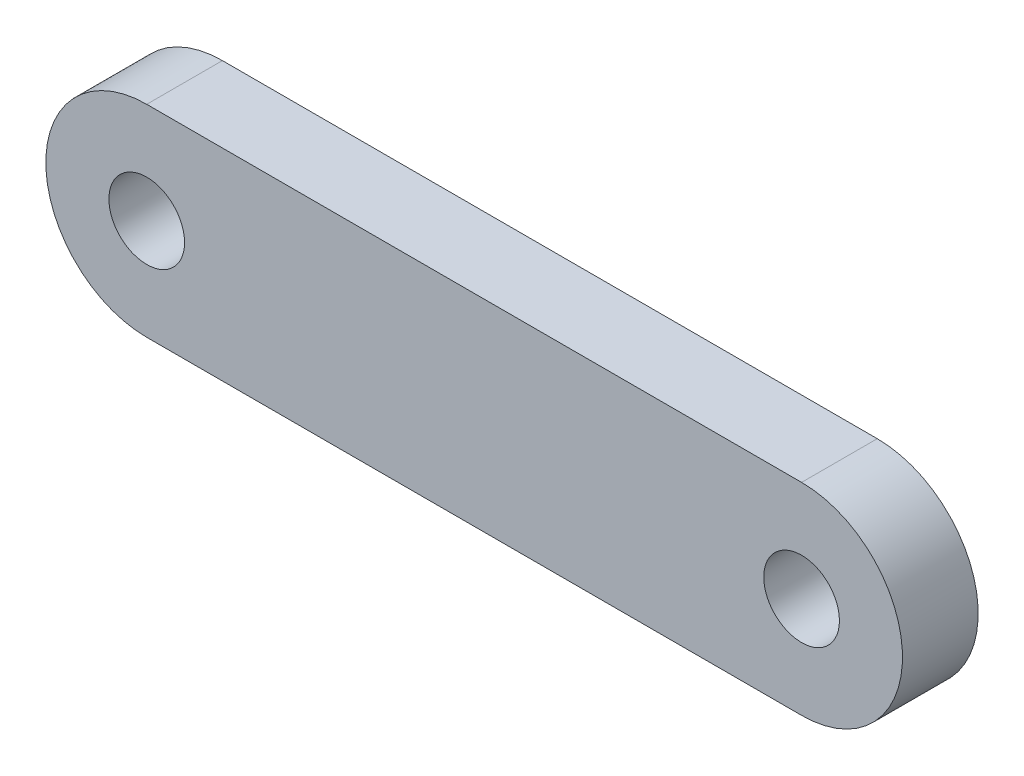
ISO-10303-21;
HEADER;
FILE_DESCRIPTION(('STEP AP214'),'2;1');
FILE_NAME('part.step','',(''),(''),'','','');
FILE_SCHEMA(('AUTOMOTIVE_DESIGN { 1 0 10303 214 1 1 1 1 }'));
ENDSEC;
DATA;
#1=APPLICATION_CONTEXT('core data for automotive mechanical design processes');
#2=APPLICATION_PROTOCOL_DEFINITION('international standard','automotive_design',2000,#1);
#3=PRODUCT_CONTEXT('',#1,'mechanical');
#4=PRODUCT('Part','Part','',(#3));
#5=PRODUCT_RELATED_PRODUCT_CATEGORY('part','',(#4));
#6=PRODUCT_DEFINITION_FORMATION('','',#4);
#7=PRODUCT_DEFINITION_CONTEXT('part definition',#1,'design');
#8=PRODUCT_DEFINITION('design','',#6,#7);
#9=PRODUCT_DEFINITION_SHAPE('','',#8);
#10=(LENGTH_UNIT() NAMED_UNIT(*) SI_UNIT(.MILLI.,.METRE.));
#11=(NAMED_UNIT(*) PLANE_ANGLE_UNIT() SI_UNIT($,.RADIAN.));
#12=(NAMED_UNIT(*) SI_UNIT($,.STERADIAN.) SOLID_ANGLE_UNIT());
#13=UNCERTAINTY_MEASURE_WITH_UNIT(LENGTH_MEASURE(1.E-05),#10,'distance_accuracy_value','');
#14=(GEOMETRIC_REPRESENTATION_CONTEXT(3) GLOBAL_UNCERTAINTY_ASSIGNED_CONTEXT((#13)) GLOBAL_UNIT_ASSIGNED_CONTEXT((#10,
#11,#12)) REPRESENTATION_CONTEXT('',''));
#15=CARTESIAN_POINT('',(0.,0.,0.));
#16=DIRECTION('',(0.,0.,1.));
#17=DIRECTION('',(1.,0.,0.));
#18=AXIS2_PLACEMENT_3D('',#15,#16,#17);
#19=CARTESIAN_POINT('',(-25.96,0.,3.));
#20=DIRECTION('',(0.,0.,1.));
#21=DIRECTION('',(1.,0.,0.));
#22=AXIS2_PLACEMENT_3D('',#19,#20,#21);
#23=PLANE('',#22);
#24=CARTESIAN_POINT('',(0.,0.,3.));
#25=DIRECTION('',(0.,0.,1.));
#26=DIRECTION('',(1.,0.,0.));
#27=AXIS2_PLACEMENT_3D('',#24,#25,#26);
#28=CIRCLE('',#27,1.5);
#29=CARTESIAN_POINT('',(1.5,0.,3.));
#30=VERTEX_POINT('',#29);
#31=EDGE_CURVE('E112',#30,#30,#28,.T.);
#32=ORIENTED_EDGE('',*,*,#31,.F.);
#33=EDGE_LOOP('',(#32));
#34=FACE_BOUND('',#33,.T.);
#35=CARTESIAN_POINT('',(-25.96,0.,3.));
#36=DIRECTION('',(0.,0.,1.));
#37=DIRECTION('',(1.,0.,0.));
#38=AXIS2_PLACEMENT_3D('',#35,#36,#37);
#39=CIRCLE('',#38,4.);
#40=CARTESIAN_POINT('',(-25.96,4.,3.));
#41=VERTEX_POINT('',#40);
#42=CARTESIAN_POINT('',(-25.96,-4.,3.));
#43=VERTEX_POINT('',#42);
#44=EDGE_CURVE('E92',#41,#43,#39,.T.);
#45=ORIENTED_EDGE('',*,*,#44,.T.);
#46=DIRECTION('',(1.,0.,0.));
#47=VECTOR('',#46,1.);
#48=CARTESIAN_POINT('',(-25.96,-4.,3.));
#49=LINE('',#48,#47);
#50=CARTESIAN_POINT('',(0.,-4.,3.));
#51=VERTEX_POINT('',#50);
#52=EDGE_CURVE('E87',#43,#51,#49,.T.);
#53=ORIENTED_EDGE('',*,*,#52,.T.);
#54=CARTESIAN_POINT('',(0.,0.,3.));
#55=DIRECTION('',(0.,0.,1.));
#56=DIRECTION('',(1.,0.,0.));
#57=AXIS2_PLACEMENT_3D('',#54,#55,#56);
#58=CIRCLE('',#57,4.);
#59=CARTESIAN_POINT('',(0.,4.,3.));
#60=VERTEX_POINT('',#59);
#61=EDGE_CURVE('E90',#51,#60,#58,.T.);
#62=ORIENTED_EDGE('',*,*,#61,.T.);
#63=DIRECTION('',(-1.,0.,0.));
#64=VECTOR('',#63,1.);
#65=CARTESIAN_POINT('',(-25.96,4.,3.));
#66=LINE('',#65,#64);
#67=EDGE_CURVE('E57',#60,#41,#66,.T.);
#68=ORIENTED_EDGE('',*,*,#67,.T.);
#69=EDGE_LOOP('',(#45,#53,#62,#68));
#70=FACE_BOUND('',#69,.T.);
#71=CARTESIAN_POINT('',(-25.96,0.,3.));
#72=DIRECTION('',(0.,0.,1.));
#73=DIRECTION('',(1.,0.,0.));
#74=AXIS2_PLACEMENT_3D('',#71,#72,#73);
#75=CIRCLE('',#74,1.5);
#76=CARTESIAN_POINT('',(-24.46,0.,3.));
#77=VERTEX_POINT('',#76);
#78=EDGE_CURVE('E134',#77,#77,#75,.T.);
#79=ORIENTED_EDGE('',*,*,#78,.F.);
#80=EDGE_LOOP('',(#79));
#81=FACE_BOUND('',#80,.T.);
#82=ADVANCED_FACE('F39',(#34,#70,#81),#23,.T.);
#83=CARTESIAN_POINT('',(-25.96,0.,0.));
#84=DIRECTION('',(0.,0.,1.));
#85=DIRECTION('',(1.,0.,0.));
#86=AXIS2_PLACEMENT_3D('',#83,#84,#85);
#87=PLANE('',#86);
#88=CARTESIAN_POINT('',(-25.96,0.,0.));
#89=DIRECTION('',(0.,0.,1.));
#90=DIRECTION('',(1.,0.,0.));
#91=AXIS2_PLACEMENT_3D('',#88,#89,#90);
#92=CIRCLE('',#91,4.);
#93=CARTESIAN_POINT('',(-25.96,4.,0.));
#94=VERTEX_POINT('',#93);
#95=CARTESIAN_POINT('',(-25.96,-4.,0.));
#96=VERTEX_POINT('',#95);
#97=EDGE_CURVE('E108',#94,#96,#92,.T.);
#98=ORIENTED_EDGE('',*,*,#97,.F.);
#99=DIRECTION('',(-1.,0.,0.));
#100=VECTOR('',#99,1.);
#101=CARTESIAN_POINT('',(-25.96,4.,0.));
#102=LINE('',#101,#100);
#103=CARTESIAN_POINT('',(0.,4.,0.));
#104=VERTEX_POINT('',#103);
#105=EDGE_CURVE('E80',#104,#94,#102,.T.);
#106=ORIENTED_EDGE('',*,*,#105,.F.);
#107=CARTESIAN_POINT('',(0.,0.,0.));
#108=DIRECTION('',(0.,0.,1.));
#109=DIRECTION('',(1.,0.,0.));
#110=AXIS2_PLACEMENT_3D('',#107,#108,#109);
#111=CIRCLE('',#110,4.);
#112=CARTESIAN_POINT('',(0.,-4.,0.));
#113=VERTEX_POINT('',#112);
#114=EDGE_CURVE('E74',#113,#104,#111,.T.);
#115=ORIENTED_EDGE('',*,*,#114,.F.);
#116=DIRECTION('',(1.,0.,0.));
#117=VECTOR('',#116,1.);
#118=CARTESIAN_POINT('',(-25.96,-4.,0.));
#119=LINE('',#118,#117);
#120=EDGE_CURVE('E97',#96,#113,#119,.T.);
#121=ORIENTED_EDGE('',*,*,#120,.F.);
#122=EDGE_LOOP('',(#98,#106,#115,#121));
#123=FACE_BOUND('',#122,.T.);
#124=CARTESIAN_POINT('',(0.,0.,0.));
#125=DIRECTION('',(0.,0.,1.));
#126=DIRECTION('',(1.,0.,0.));
#127=AXIS2_PLACEMENT_3D('',#124,#125,#126);
#128=CIRCLE('',#127,1.5);
#129=CARTESIAN_POINT('',(1.5,0.,0.));
#130=VERTEX_POINT('',#129);
#131=EDGE_CURVE('E130',#130,#130,#128,.T.);
#132=ORIENTED_EDGE('',*,*,#131,.T.);
#133=EDGE_LOOP('',(#132));
#134=FACE_BOUND('',#133,.T.);
#135=CARTESIAN_POINT('',(-25.96,0.,0.));
#136=DIRECTION('',(0.,0.,1.));
#137=DIRECTION('',(1.,0.,0.));
#138=AXIS2_PLACEMENT_3D('',#135,#136,#137);
#139=CIRCLE('',#138,1.5);
#140=CARTESIAN_POINT('',(-24.46,0.,0.));
#141=VERTEX_POINT('',#140);
#142=EDGE_CURVE('E138',#141,#141,#139,.T.);
#143=ORIENTED_EDGE('',*,*,#142,.T.);
#144=EDGE_LOOP('',(#143));
#145=FACE_BOUND('',#144,.T.);
#146=ADVANCED_FACE('F125',(#123,#134,#145),#87,.F.);
#147=CARTESIAN_POINT('',(-25.96,0.,3.));
#148=DIRECTION('',(0.,0.,-1.));
#149=DIRECTION('',(-1.,0.,0.));
#150=AXIS2_PLACEMENT_3D('',#147,#148,#149);
#151=CYLINDRICAL_SURFACE('',#150,4.);
#152=ORIENTED_EDGE('',*,*,#97,.T.);
#153=DIRECTION('',(0.,0.,-1.));
#154=VECTOR('',#153,1.);
#155=CARTESIAN_POINT('',(-25.96,-4.,3.));
#156=LINE('',#155,#154);
#157=EDGE_CURVE('E11',#43,#96,#156,.T.);
#158=ORIENTED_EDGE('',*,*,#157,.F.);
#159=ORIENTED_EDGE('',*,*,#44,.F.);
#160=DIRECTION('',(0.,0.,-1.));
#161=VECTOR('',#160,1.);
#162=CARTESIAN_POINT('',(-25.96,4.,3.));
#163=LINE('',#162,#161);
#164=EDGE_CURVE('E104',#41,#94,#163,.T.);
#165=ORIENTED_EDGE('',*,*,#164,.T.);
#166=EDGE_LOOP('',(#152,#158,#159,#165));
#167=FACE_BOUND('',#166,.T.);
#168=ADVANCED_FACE('F41',(#167),#151,.T.);
#169=CARTESIAN_POINT('',(-25.96,-4.,3.));
#170=DIRECTION('',(0.,1.,0.));
#171=DIRECTION('',(-1.,0.,0.));
#172=AXIS2_PLACEMENT_3D('',#169,#170,#171);
#173=PLANE('',#172);
#174=ORIENTED_EDGE('',*,*,#120,.T.);
#175=DIRECTION('',(0.,0.,-1.));
#176=VECTOR('',#175,1.);
#177=CARTESIAN_POINT('',(0.,-4.,3.));
#178=LINE('',#177,#176);
#179=EDGE_CURVE('E49',#51,#113,#178,.T.);
#180=ORIENTED_EDGE('',*,*,#179,.F.);
#181=ORIENTED_EDGE('',*,*,#52,.F.);
#182=ORIENTED_EDGE('',*,*,#157,.T.);
#183=EDGE_LOOP('',(#174,#180,#181,#182));
#184=FACE_BOUND('',#183,.T.);
#185=ADVANCED_FACE('F96',(#184),#173,.F.);
#186=CARTESIAN_POINT('',(0.,0.,3.));
#187=DIRECTION('',(0.,0.,-1.));
#188=DIRECTION('',(-1.,0.,0.));
#189=AXIS2_PLACEMENT_3D('',#186,#187,#188);
#190=CYLINDRICAL_SURFACE('',#189,4.);
#191=ORIENTED_EDGE('',*,*,#114,.T.);
#192=DIRECTION('',(0.,0.,-1.));
#193=VECTOR('',#192,1.);
#194=CARTESIAN_POINT('',(0.,4.,3.));
#195=LINE('',#194,#193);
#196=EDGE_CURVE('E99',#60,#104,#195,.T.);
#197=ORIENTED_EDGE('',*,*,#196,.F.);
#198=ORIENTED_EDGE('',*,*,#61,.F.);
#199=ORIENTED_EDGE('',*,*,#179,.T.);
#200=EDGE_LOOP('',(#191,#197,#198,#199));
#201=FACE_BOUND('',#200,.T.);
#202=ADVANCED_FACE('F100',(#201),#190,.T.);
#203=CARTESIAN_POINT('',(-25.96,4.,3.));
#204=DIRECTION('',(0.,-1.,0.));
#205=DIRECTION('',(0.,0.,-1.));
#206=AXIS2_PLACEMENT_3D('',#203,#204,#205);
#207=PLANE('',#206);
#208=ORIENTED_EDGE('',*,*,#105,.T.);
#209=ORIENTED_EDGE('',*,*,#164,.F.);
#210=ORIENTED_EDGE('',*,*,#67,.F.);
#211=ORIENTED_EDGE('',*,*,#196,.T.);
#212=EDGE_LOOP('',(#208,#209,#210,#211));
#213=FACE_BOUND('',#212,.T.);
#214=ADVANCED_FACE('F122',(#213),#207,.F.);
#215=CARTESIAN_POINT('',(0.,0.,3.));
#216=DIRECTION('',(0.,0.,-1.));
#217=DIRECTION('',(-1.,0.,0.));
#218=AXIS2_PLACEMENT_3D('',#215,#216,#217);
#219=CYLINDRICAL_SURFACE('',#218,1.5);
#220=ORIENTED_EDGE('',*,*,#31,.T.);
#221=EDGE_LOOP('',(#220));
#222=FACE_BOUND('',#221,.T.);
#223=ORIENTED_EDGE('',*,*,#131,.F.);
#224=EDGE_LOOP('',(#223));
#225=FACE_BOUND('',#224,.T.);
#226=ADVANCED_FACE('F157',(#222,#225),#219,.F.);
#227=CARTESIAN_POINT('',(-25.96,0.,3.));
#228=DIRECTION('',(0.,0.,-1.));
#229=DIRECTION('',(-1.,0.,0.));
#230=AXIS2_PLACEMENT_3D('',#227,#228,#229);
#231=CYLINDRICAL_SURFACE('',#230,1.5);
#232=ORIENTED_EDGE('',*,*,#78,.T.);
#233=EDGE_LOOP('',(#232));
#234=FACE_BOUND('',#233,.T.);
#235=ORIENTED_EDGE('',*,*,#142,.F.);
#236=EDGE_LOOP('',(#235));
#237=FACE_BOUND('',#236,.T.);
#238=ADVANCED_FACE('F146',(#234,#237),#231,.F.);
#239=CLOSED_SHELL('',(#82,#146,#168,#185,#202,#214,#226,#238));
#240=MANIFOLD_SOLID_BREP('B2',#239);
#241=ADVANCED_BREP_SHAPE_REPRESENTATION('',(#18,#240),#14);
#242=SHAPE_DEFINITION_REPRESENTATION(#9,#241);
ENDSEC;
END-ISO-10303-21;
